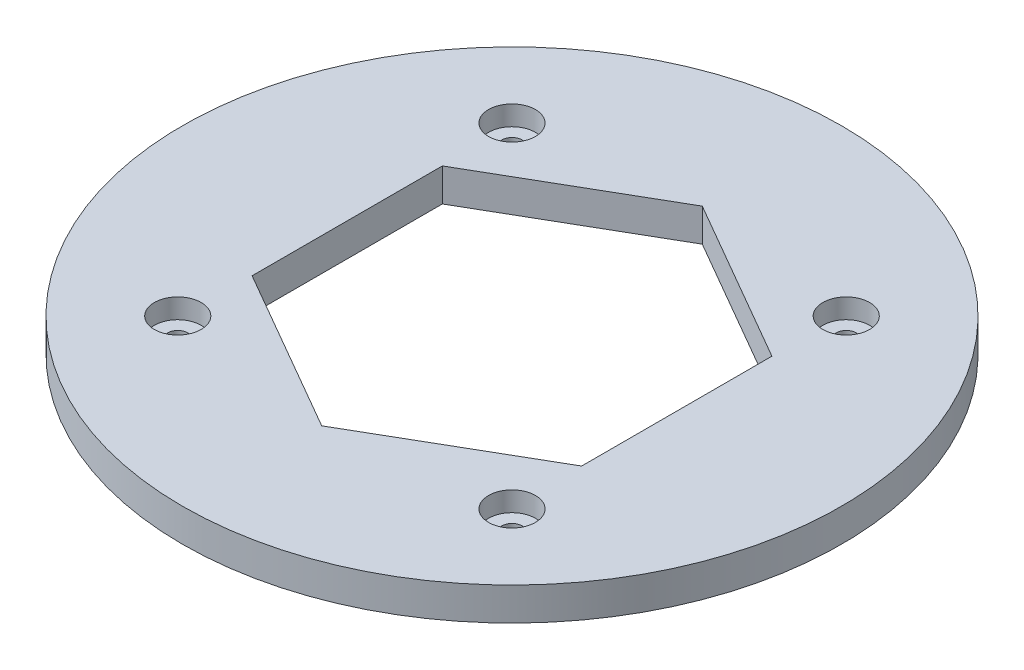
ISO-10303-21;
HEADER;
FILE_DESCRIPTION(('STEP AP214'),'2;1');
FILE_NAME('part.step','',(''),(''),'','','');
FILE_SCHEMA(('AUTOMOTIVE_DESIGN { 1 0 10303 214 1 1 1 1 }'));
ENDSEC;
DATA;
#1=APPLICATION_CONTEXT('core data for automotive mechanical design processes');
#2=APPLICATION_PROTOCOL_DEFINITION('international standard','automotive_design',2000,#1);
#3=PRODUCT_CONTEXT('',#1,'mechanical');
#4=PRODUCT('Part','Part','',(#3));
#5=PRODUCT_RELATED_PRODUCT_CATEGORY('part','',(#4));
#6=PRODUCT_DEFINITION_FORMATION('','',#4);
#7=PRODUCT_DEFINITION_CONTEXT('part definition',#1,'design');
#8=PRODUCT_DEFINITION('design','',#6,#7);
#9=PRODUCT_DEFINITION_SHAPE('','',#8);
#10=(LENGTH_UNIT() NAMED_UNIT(*) SI_UNIT(.MILLI.,.METRE.));
#11=(NAMED_UNIT(*) PLANE_ANGLE_UNIT() SI_UNIT($,.RADIAN.));
#12=(NAMED_UNIT(*) SI_UNIT($,.STERADIAN.) SOLID_ANGLE_UNIT());
#13=UNCERTAINTY_MEASURE_WITH_UNIT(LENGTH_MEASURE(1.E-05),#10,'distance_accuracy_value','');
#14=(GEOMETRIC_REPRESENTATION_CONTEXT(3) GLOBAL_UNCERTAINTY_ASSIGNED_CONTEXT((#13)) GLOBAL_UNIT_ASSIGNED_CONTEXT((#10,
#11,#12)) REPRESENTATION_CONTEXT('',''));
#15=CARTESIAN_POINT('',(0.,0.,0.));
#16=DIRECTION('',(0.,0.,1.));
#17=DIRECTION('',(1.,0.,0.));
#18=AXIS2_PLACEMENT_3D('',#15,#16,#17);
#19=CARTESIAN_POINT('',(-25.3553390593274,5.,-25.3553390593274));
#20=DIRECTION('',(0.,-1.,0.));
#21=DIRECTION('',(0.,0.,-1.));
#22=AXIS2_PLACEMENT_3D('',#19,#20,#21);
#23=CYLINDRICAL_SURFACE('',#22,3.55);
#24=CARTESIAN_POINT('',(-25.3553390593274,2.,-25.3553390593274));
#25=DIRECTION('',(0.,1.,0.));
#26=DIRECTION('',(0.,0.,1.));
#27=AXIS2_PLACEMENT_3D('',#24,#25,#26);
#28=CIRCLE('',#27,3.55);
#29=CARTESIAN_POINT('',(-25.3553390593274,2.,-21.8053390593274));
#30=VERTEX_POINT('',#29);
#31=EDGE_CURVE('E224',#30,#30,#28,.T.);
#32=ORIENTED_EDGE('',*,*,#31,.F.);
#33=EDGE_LOOP('',(#32));
#34=FACE_BOUND('',#33,.T.);
#35=CARTESIAN_POINT('',(-25.3553390593274,5.,-25.3553390593274));
#36=DIRECTION('',(0.,1.,0.));
#37=DIRECTION('',(0.,0.,1.));
#38=AXIS2_PLACEMENT_3D('',#35,#36,#37);
#39=CIRCLE('',#38,3.55);
#40=CARTESIAN_POINT('',(-25.3553390593274,5.,-21.8053390593274));
#41=VERTEX_POINT('',#40);
#42=EDGE_CURVE('E209',#41,#41,#39,.T.);
#43=ORIENTED_EDGE('',*,*,#42,.T.);
#44=EDGE_LOOP('',(#43));
#45=FACE_BOUND('',#44,.T.);
#46=ADVANCED_FACE('F44',(#34,#45),#23,.F.);
#47=CARTESIAN_POINT('',(0.,5.,0.));
#48=DIRECTION('',(0.,-1.,0.));
#49=DIRECTION('',(0.,0.,-1.));
#50=AXIS2_PLACEMENT_3D('',#47,#48,#49);
#51=CYLINDRICAL_SURFACE('',#50,50.);
#52=CARTESIAN_POINT('',(0.,5.,0.));
#53=DIRECTION('',(0.,1.,0.));
#54=DIRECTION('',(0.,0.,1.));
#55=AXIS2_PLACEMENT_3D('',#52,#53,#54);
#56=CIRCLE('',#55,50.);
#57=CARTESIAN_POINT('',(0.,5.,50.));
#58=VERTEX_POINT('',#57);
#59=EDGE_CURVE('E205',#58,#58,#56,.T.);
#60=ORIENTED_EDGE('',*,*,#59,.F.);
#61=EDGE_LOOP('',(#60));
#62=FACE_BOUND('',#61,.T.);
#63=CARTESIAN_POINT('',(0.,0.,0.));
#64=DIRECTION('',(0.,1.,0.));
#65=DIRECTION('',(0.,0.,1.));
#66=AXIS2_PLACEMENT_3D('',#63,#64,#65);
#67=CIRCLE('',#66,50.);
#68=CARTESIAN_POINT('',(0.,0.,50.));
#69=VERTEX_POINT('',#68);
#70=EDGE_CURVE('E193',#69,#69,#67,.T.);
#71=ORIENTED_EDGE('',*,*,#70,.T.);
#72=EDGE_LOOP('',(#71));
#73=FACE_BOUND('',#72,.T.);
#74=ADVANCED_FACE('F270',(#62,#73),#51,.T.);
#75=CARTESIAN_POINT('',(25.3553390593274,5.,-25.3553390593274));
#76=DIRECTION('',(0.,-1.,0.));
#77=DIRECTION('',(0.,0.,-1.));
#78=AXIS2_PLACEMENT_3D('',#75,#76,#77);
#79=CYLINDRICAL_SURFACE('',#78,3.55);
#80=CARTESIAN_POINT('',(25.3553390593274,2.,-25.3553390593274));
#81=DIRECTION('',(0.,1.,0.));
#82=DIRECTION('',(0.,0.,1.));
#83=AXIS2_PLACEMENT_3D('',#80,#81,#82);
#84=CIRCLE('',#83,3.55);
#85=CARTESIAN_POINT('',(25.3553390593274,2.,-21.8053390593274));
#86=VERTEX_POINT('',#85);
#87=EDGE_CURVE('E177',#86,#86,#84,.F.);
#88=ORIENTED_EDGE('',*,*,#87,.T.);
#89=EDGE_LOOP('',(#88));
#90=FACE_BOUND('',#89,.T.);
#91=CARTESIAN_POINT('',(25.3553390593274,5.,-25.3553390593274));
#92=DIRECTION('',(0.,1.,0.));
#93=DIRECTION('',(0.,0.,1.));
#94=AXIS2_PLACEMENT_3D('',#91,#92,#93);
#95=CIRCLE('',#94,3.55);
#96=CARTESIAN_POINT('',(25.3553390593274,5.,-21.8053390593274));
#97=VERTEX_POINT('',#96);
#98=EDGE_CURVE('E201',#97,#97,#95,.F.);
#99=ORIENTED_EDGE('',*,*,#98,.F.);
#100=EDGE_LOOP('',(#99));
#101=FACE_BOUND('',#100,.T.);
#102=ADVANCED_FACE('F276',(#90,#101),#79,.F.);
#103=CARTESIAN_POINT('',(25.3553390593274,5.,25.3553390593274));
#104=DIRECTION('',(0.,-1.,0.));
#105=DIRECTION('',(0.,0.,-1.));
#106=AXIS2_PLACEMENT_3D('',#103,#104,#105);
#107=CYLINDRICAL_SURFACE('',#106,3.55000000000001);
#108=CARTESIAN_POINT('',(25.3553390593274,2.,25.3553390593274));
#109=DIRECTION('',(0.,1.,0.));
#110=DIRECTION('',(0.,0.,1.));
#111=AXIS2_PLACEMENT_3D('',#108,#109,#110);
#112=CIRCLE('',#111,3.55000000000001);
#113=CARTESIAN_POINT('',(25.3553390593274,2.,28.9053390593274));
#114=VERTEX_POINT('',#113);
#115=EDGE_CURVE('E217',#114,#114,#112,.T.);
#116=ORIENTED_EDGE('',*,*,#115,.F.);
#117=EDGE_LOOP('',(#116));
#118=FACE_BOUND('',#117,.T.);
#119=CARTESIAN_POINT('',(25.3553390593274,5.,25.3553390593274));
#120=DIRECTION('',(0.,1.,0.));
#121=DIRECTION('',(0.,0.,1.));
#122=AXIS2_PLACEMENT_3D('',#119,#120,#121);
#123=CIRCLE('',#122,3.55000000000001);
#124=CARTESIAN_POINT('',(25.3553390593274,5.,28.9053390593274));
#125=VERTEX_POINT('',#124);
#126=EDGE_CURVE('E197',#125,#125,#123,.T.);
#127=ORIENTED_EDGE('',*,*,#126,.T.);
#128=EDGE_LOOP('',(#127));
#129=FACE_BOUND('',#128,.T.);
#130=ADVANCED_FACE('F46',(#118,#129),#107,.F.);
#131=CARTESIAN_POINT('',(-25.3553390593274,5.,25.3553390593274));
#132=DIRECTION('',(0.,-1.,0.));
#133=DIRECTION('',(0.,0.,-1.));
#134=AXIS2_PLACEMENT_3D('',#131,#132,#133);
#135=CYLINDRICAL_SURFACE('',#134,3.55);
#136=CARTESIAN_POINT('',(-25.3553390593274,2.,25.3553390593274));
#137=DIRECTION('',(0.,1.,0.));
#138=DIRECTION('',(0.,0.,1.));
#139=AXIS2_PLACEMENT_3D('',#136,#137,#138);
#140=CIRCLE('',#139,3.55);
#141=CARTESIAN_POINT('',(-25.3553390593274,2.,28.9053390593274));
#142=VERTEX_POINT('',#141);
#143=EDGE_CURVE('E157',#142,#142,#140,.F.);
#144=ORIENTED_EDGE('',*,*,#143,.T.);
#145=EDGE_LOOP('',(#144));
#146=FACE_BOUND('',#145,.T.);
#147=CARTESIAN_POINT('',(-25.3553390593274,5.,25.3553390593274));
#148=DIRECTION('',(0.,1.,0.));
#149=DIRECTION('',(0.,0.,1.));
#150=AXIS2_PLACEMENT_3D('',#147,#148,#149);
#151=CIRCLE('',#150,3.55);
#152=CARTESIAN_POINT('',(-25.3553390593274,5.,28.9053390593274));
#153=VERTEX_POINT('',#152);
#154=EDGE_CURVE('E213',#153,#153,#151,.F.);
#155=ORIENTED_EDGE('',*,*,#154,.F.);
#156=EDGE_LOOP('',(#155));
#157=FACE_BOUND('',#156,.T.);
#158=ADVANCED_FACE('F282',(#146,#157),#135,.F.);
#159=CARTESIAN_POINT('',(0.,5.,0.));
#160=DIRECTION('',(0.,1.,0.));
#161=DIRECTION('',(0.,0.,1.));
#162=AXIS2_PLACEMENT_3D('',#159,#160,#161);
#163=PLANE('',#162);
#164=DIRECTION('',(-0.866025403784439,0.,-0.5));
#165=VECTOR('',#164,1.);
#166=CARTESIAN_POINT('',(25.,5.,-14.4337567297407));
#167=LINE('',#166,#165);
#168=CARTESIAN_POINT('',(25.,5.,-14.4337567297407));
#169=VERTEX_POINT('',#168);
#170=CARTESIAN_POINT('',(0.,5.,-28.8675134594813));
#171=VERTEX_POINT('',#170);
#172=EDGE_CURVE('E60',#169,#171,#167,.T.);
#173=ORIENTED_EDGE('',*,*,#172,.F.);
#174=DIRECTION('',(0.,0.,-1.));
#175=VECTOR('',#174,1.);
#176=CARTESIAN_POINT('',(25.,5.,14.4337567297406));
#177=LINE('',#176,#175);
#178=CARTESIAN_POINT('',(25.,5.,14.4337567297406));
#179=VERTEX_POINT('',#178);
#180=EDGE_CURVE('E131',#179,#169,#177,.T.);
#181=ORIENTED_EDGE('',*,*,#180,.F.);
#182=DIRECTION('',(0.866025403784438,0.,-0.5));
#183=VECTOR('',#182,1.);
#184=CARTESIAN_POINT('',(0.,5.,28.8675134594813));
#185=LINE('',#184,#183);
#186=CARTESIAN_POINT('',(0.,5.,28.8675134594813));
#187=VERTEX_POINT('',#186);
#188=EDGE_CURVE('E124',#187,#179,#185,.T.);
#189=ORIENTED_EDGE('',*,*,#188,.F.);
#190=DIRECTION('',(0.866025403784439,0.,0.5));
#191=VECTOR('',#190,1.);
#192=CARTESIAN_POINT('',(-25.,5.,14.4337567297407));
#193=LINE('',#192,#191);
#194=CARTESIAN_POINT('',(-25.,5.,14.4337567297407));
#195=VERTEX_POINT('',#194);
#196=EDGE_CURVE('E120',#195,#187,#193,.T.);
#197=ORIENTED_EDGE('',*,*,#196,.F.);
#198=DIRECTION('',(0.,0.,1.));
#199=VECTOR('',#198,1.);
#200=CARTESIAN_POINT('',(-25.,5.,-14.4337567297406));
#201=LINE('',#200,#199);
#202=CARTESIAN_POINT('',(-25.,5.,-14.4337567297406));
#203=VERTEX_POINT('',#202);
#204=EDGE_CURVE('E101',#203,#195,#201,.T.);
#205=ORIENTED_EDGE('',*,*,#204,.F.);
#206=DIRECTION('',(-0.866025403784438,0.,0.5));
#207=VECTOR('',#206,1.);
#208=CARTESIAN_POINT('',(0.,5.,-28.8675134594813));
#209=LINE('',#208,#207);
#210=EDGE_CURVE('E111',#171,#203,#209,.T.);
#211=ORIENTED_EDGE('',*,*,#210,.F.);
#212=EDGE_LOOP('',(#173,#181,#189,#197,#205,#211));
#213=FACE_BOUND('',#212,.T.);
#214=ORIENTED_EDGE('',*,*,#126,.F.);
#215=EDGE_LOOP('',(#214));
#216=FACE_BOUND('',#215,.T.);
#217=ORIENTED_EDGE('',*,*,#98,.T.);
#218=EDGE_LOOP('',(#217));
#219=FACE_BOUND('',#218,.T.);
#220=ORIENTED_EDGE('',*,*,#59,.T.);
#221=EDGE_LOOP('',(#220));
#222=FACE_BOUND('',#221,.T.);
#223=ORIENTED_EDGE('',*,*,#42,.F.);
#224=EDGE_LOOP('',(#223));
#225=FACE_BOUND('',#224,.T.);
#226=ORIENTED_EDGE('',*,*,#154,.T.);
#227=EDGE_LOOP('',(#226));
#228=FACE_BOUND('',#227,.T.);
#229=ADVANCED_FACE('F116',(#213,#216,#219,#222,#225,#228),#163,.T.);
#230=CARTESIAN_POINT('',(0.,0.,0.));
#231=DIRECTION('',(0.,1.,0.));
#232=DIRECTION('',(0.,0.,1.));
#233=AXIS2_PLACEMENT_3D('',#230,#231,#232);
#234=PLANE('',#233);
#235=DIRECTION('',(0.,0.,-1.));
#236=VECTOR('',#235,1.);
#237=CARTESIAN_POINT('',(25.,0.,0.));
#238=LINE('',#237,#236);
#239=CARTESIAN_POINT('',(25.,0.,14.4337567297406));
#240=VERTEX_POINT('',#239);
#241=CARTESIAN_POINT('',(25.,0.,-14.4337567297407));
#242=VERTEX_POINT('',#241);
#243=EDGE_CURVE('E53',#240,#242,#238,.T.);
#244=ORIENTED_EDGE('',*,*,#243,.T.);
#245=DIRECTION('',(-0.866025403784439,0.,-0.5));
#246=VECTOR('',#245,1.);
#247=CARTESIAN_POINT('',(12.5,0.,-21.650635094611));
#248=LINE('',#247,#246);
#249=CARTESIAN_POINT('',(0.,0.,-28.8675134594813));
#250=VERTEX_POINT('',#249);
#251=EDGE_CURVE('E11',#242,#250,#248,.T.);
#252=ORIENTED_EDGE('',*,*,#251,.T.);
#253=DIRECTION('',(-0.866025403784439,0.,0.5));
#254=VECTOR('',#253,1.);
#255=CARTESIAN_POINT('',(-12.5,0.,-21.650635094611));
#256=LINE('',#255,#254);
#257=CARTESIAN_POINT('',(-25.,0.,-14.4337567297406));
#258=VERTEX_POINT('',#257);
#259=EDGE_CURVE('E228',#250,#258,#256,.T.);
#260=ORIENTED_EDGE('',*,*,#259,.T.);
#261=DIRECTION('',(0.,0.,1.));
#262=VECTOR('',#261,1.);
#263=CARTESIAN_POINT('',(-25.,0.,0.));
#264=LINE('',#263,#262);
#265=CARTESIAN_POINT('',(-25.,0.,14.4337567297407));
#266=VERTEX_POINT('',#265);
#267=EDGE_CURVE('E104',#258,#266,#264,.T.);
#268=ORIENTED_EDGE('',*,*,#267,.T.);
#269=DIRECTION('',(0.866025403784439,0.,0.5));
#270=VECTOR('',#269,1.);
#271=CARTESIAN_POINT('',(-12.5,0.,21.650635094611));
#272=LINE('',#271,#270);
#273=CARTESIAN_POINT('',(0.,0.,28.8675134594813));
#274=VERTEX_POINT('',#273);
#275=EDGE_CURVE('E233',#266,#274,#272,.T.);
#276=ORIENTED_EDGE('',*,*,#275,.T.);
#277=DIRECTION('',(0.866025403784439,0.,-0.5));
#278=VECTOR('',#277,1.);
#279=CARTESIAN_POINT('',(12.5,0.,21.650635094611));
#280=LINE('',#279,#278);
#281=EDGE_CURVE('E237',#274,#240,#280,.T.);
#282=ORIENTED_EDGE('',*,*,#281,.T.);
#283=EDGE_LOOP('',(#244,#252,#260,#268,#276,#282));
#284=FACE_BOUND('',#283,.T.);
#285=CARTESIAN_POINT('',(0.,0.,35.3553390593274));
#286=DIRECTION('',(0.,-1.,0.));
#287=DIRECTION('',(0.,0.,-1.));
#288=AXIS2_PLACEMENT_3D('',#285,#286,#287);
#289=CIRCLE('',#288,5.5);
#290=CARTESIAN_POINT('',(0.,0.,29.8553390593274));
#291=VERTEX_POINT('',#290);
#292=EDGE_CURVE('E138',#291,#291,#289,.T.);
#293=ORIENTED_EDGE('',*,*,#292,.F.);
#294=EDGE_LOOP('',(#293));
#295=FACE_BOUND('',#294,.T.);
#296=ORIENTED_EDGE('',*,*,#70,.F.);
#297=EDGE_LOOP('',(#296));
#298=FACE_BOUND('',#297,.T.);
#299=CARTESIAN_POINT('',(25.3553390593274,0.,25.3553390593274));
#300=DIRECTION('',(0.,1.,0.));
#301=DIRECTION('',(0.,0.,1.));
#302=AXIS2_PLACEMENT_3D('',#299,#300,#301);
#303=CIRCLE('',#302,1.55000000000001);
#304=CARTESIAN_POINT('',(25.3553390593274,0.,26.9053390593274));
#305=VERTEX_POINT('',#304);
#306=EDGE_CURVE('E185',#305,#305,#303,.T.);
#307=ORIENTED_EDGE('',*,*,#306,.T.);
#308=EDGE_LOOP('',(#307));
#309=FACE_BOUND('',#308,.T.);
#310=CARTESIAN_POINT('',(25.3553390593274,0.,-25.3553390593274));
#311=DIRECTION('',(0.,1.,0.));
#312=DIRECTION('',(0.,0.,1.));
#313=AXIS2_PLACEMENT_3D('',#310,#311,#312);
#314=CIRCLE('',#313,1.55);
#315=CARTESIAN_POINT('',(25.3553390593274,0.,-23.8053390593274));
#316=VERTEX_POINT('',#315);
#317=EDGE_CURVE('E173',#316,#316,#314,.F.);
#318=ORIENTED_EDGE('',*,*,#317,.F.);
#319=EDGE_LOOP('',(#318));
#320=FACE_BOUND('',#319,.T.);
#321=CARTESIAN_POINT('',(-25.3553390593274,0.,-25.3553390593274));
#322=DIRECTION('',(0.,1.,0.));
#323=DIRECTION('',(0.,0.,1.));
#324=AXIS2_PLACEMENT_3D('',#321,#322,#323);
#325=CIRCLE('',#324,1.55);
#326=CARTESIAN_POINT('',(-25.3553390593274,0.,-23.8053390593274));
#327=VERTEX_POINT('',#326);
#328=EDGE_CURVE('E165',#327,#327,#325,.T.);
#329=ORIENTED_EDGE('',*,*,#328,.T.);
#330=EDGE_LOOP('',(#329));
#331=FACE_BOUND('',#330,.T.);
#332=CARTESIAN_POINT('',(-25.3553390593274,0.,25.3553390593274));
#333=DIRECTION('',(0.,1.,0.));
#334=DIRECTION('',(0.,0.,1.));
#335=AXIS2_PLACEMENT_3D('',#332,#333,#334);
#336=CIRCLE('',#335,1.55);
#337=CARTESIAN_POINT('',(-25.3553390593274,0.,26.9053390593274));
#338=VERTEX_POINT('',#337);
#339=EDGE_CURVE('E153',#338,#338,#336,.F.);
#340=ORIENTED_EDGE('',*,*,#339,.F.);
#341=EDGE_LOOP('',(#340));
#342=FACE_BOUND('',#341,.T.);
#343=ADVANCED_FACE('F243',(#284,#295,#298,#309,#320,#331,#342),#234,.F.);
#344=CARTESIAN_POINT('',(25.3553390593274,2.,25.3553390593274));
#345=DIRECTION('',(0.,-1.,0.));
#346=DIRECTION('',(0.,0.,-1.));
#347=AXIS2_PLACEMENT_3D('',#344,#345,#346);
#348=CYLINDRICAL_SURFACE('',#347,1.55000000000001);
#349=CARTESIAN_POINT('',(25.3553390593274,2.,25.3553390593274));
#350=DIRECTION('',(0.,1.,0.));
#351=DIRECTION('',(0.,0.,1.));
#352=AXIS2_PLACEMENT_3D('',#349,#350,#351);
#353=CIRCLE('',#352,1.55000000000001);
#354=CARTESIAN_POINT('',(25.3553390593274,2.,26.9053390593274));
#355=VERTEX_POINT('',#354);
#356=EDGE_CURVE('E189',#355,#355,#353,.T.);
#357=ORIENTED_EDGE('',*,*,#356,.T.);
#358=EDGE_LOOP('',(#357));
#359=FACE_BOUND('',#358,.T.);
#360=ORIENTED_EDGE('',*,*,#306,.F.);
#361=EDGE_LOOP('',(#360));
#362=FACE_BOUND('',#361,.T.);
#363=ADVANCED_FACE('F324',(#359,#362),#348,.F.);
#364=CARTESIAN_POINT('',(0.,2.,0.));
#365=DIRECTION('',(0.,1.,0.));
#366=DIRECTION('',(0.,0.,1.));
#367=AXIS2_PLACEMENT_3D('',#364,#365,#366);
#368=PLANE('',#367);
#369=ORIENTED_EDGE('',*,*,#356,.F.);
#370=EDGE_LOOP('',(#369));
#371=FACE_BOUND('',#370,.T.);
#372=ORIENTED_EDGE('',*,*,#115,.T.);
#373=EDGE_LOOP('',(#372));
#374=FACE_BOUND('',#373,.T.);
#375=ADVANCED_FACE('F328',(#371,#374),#368,.T.);
#376=CARTESIAN_POINT('',(25.3553390593274,2.,-25.3553390593274));
#377=DIRECTION('',(0.,-1.,0.));
#378=DIRECTION('',(0.,0.,-1.));
#379=AXIS2_PLACEMENT_3D('',#376,#377,#378);
#380=CYLINDRICAL_SURFACE('',#379,1.55);
#381=CARTESIAN_POINT('',(25.3553390593274,2.,-25.3553390593274));
#382=DIRECTION('',(0.,1.,0.));
#383=DIRECTION('',(0.,0.,1.));
#384=AXIS2_PLACEMENT_3D('',#381,#382,#383);
#385=CIRCLE('',#384,1.55);
#386=CARTESIAN_POINT('',(25.3553390593274,2.,-23.8053390593274));
#387=VERTEX_POINT('',#386);
#388=EDGE_CURVE('E181',#387,#387,#385,.F.);
#389=ORIENTED_EDGE('',*,*,#388,.F.);
#390=EDGE_LOOP('',(#389));
#391=FACE_BOUND('',#390,.T.);
#392=ORIENTED_EDGE('',*,*,#317,.T.);
#393=EDGE_LOOP('',(#392));
#394=FACE_BOUND('',#393,.T.);
#395=ADVANCED_FACE('F334',(#391,#394),#380,.F.);
#396=CARTESIAN_POINT('',(0.,2.,0.));
#397=DIRECTION('',(0.,1.,0.));
#398=DIRECTION('',(0.,0.,1.));
#399=AXIS2_PLACEMENT_3D('',#396,#397,#398);
#400=PLANE('',#399);
#401=ORIENTED_EDGE('',*,*,#87,.F.);
#402=EDGE_LOOP('',(#401));
#403=FACE_BOUND('',#402,.T.);
#404=ORIENTED_EDGE('',*,*,#388,.T.);
#405=EDGE_LOOP('',(#404));
#406=FACE_BOUND('',#405,.T.);
#407=ADVANCED_FACE('F338',(#403,#406),#400,.T.);
#408=CARTESIAN_POINT('',(-25.3553390593274,2.,-25.3553390593274));
#409=DIRECTION('',(0.,-1.,0.));
#410=DIRECTION('',(0.,0.,-1.));
#411=AXIS2_PLACEMENT_3D('',#408,#409,#410);
#412=CYLINDRICAL_SURFACE('',#411,1.55);
#413=CARTESIAN_POINT('',(-25.3553390593274,2.,-25.3553390593274));
#414=DIRECTION('',(0.,1.,0.));
#415=DIRECTION('',(0.,0.,1.));
#416=AXIS2_PLACEMENT_3D('',#413,#414,#415);
#417=CIRCLE('',#416,1.55);
#418=CARTESIAN_POINT('',(-25.3553390593274,2.,-23.8053390593274));
#419=VERTEX_POINT('',#418);
#420=EDGE_CURVE('E169',#419,#419,#417,.T.);
#421=ORIENTED_EDGE('',*,*,#420,.T.);
#422=EDGE_LOOP('',(#421));
#423=FACE_BOUND('',#422,.T.);
#424=ORIENTED_EDGE('',*,*,#328,.F.);
#425=EDGE_LOOP('',(#424));
#426=FACE_BOUND('',#425,.T.);
#427=ADVANCED_FACE('F342',(#423,#426),#412,.F.);
#428=CARTESIAN_POINT('',(0.,2.,0.));
#429=DIRECTION('',(0.,1.,0.));
#430=DIRECTION('',(0.,0.,1.));
#431=AXIS2_PLACEMENT_3D('',#428,#429,#430);
#432=PLANE('',#431);
#433=ORIENTED_EDGE('',*,*,#420,.F.);
#434=EDGE_LOOP('',(#433));
#435=FACE_BOUND('',#434,.T.);
#436=ORIENTED_EDGE('',*,*,#31,.T.);
#437=EDGE_LOOP('',(#436));
#438=FACE_BOUND('',#437,.T.);
#439=ADVANCED_FACE('F319',(#435,#438),#432,.T.);
#440=CARTESIAN_POINT('',(-25.3553390593274,2.,25.3553390593274));
#441=DIRECTION('',(0.,-1.,0.));
#442=DIRECTION('',(0.,0.,-1.));
#443=AXIS2_PLACEMENT_3D('',#440,#441,#442);
#444=CYLINDRICAL_SURFACE('',#443,1.55);
#445=CARTESIAN_POINT('',(-25.3553390593274,2.,25.3553390593274));
#446=DIRECTION('',(0.,1.,0.));
#447=DIRECTION('',(0.,0.,1.));
#448=AXIS2_PLACEMENT_3D('',#445,#446,#447);
#449=CIRCLE('',#448,1.55);
#450=CARTESIAN_POINT('',(-25.3553390593274,2.,26.9053390593274));
#451=VERTEX_POINT('',#450);
#452=EDGE_CURVE('E161',#451,#451,#449,.F.);
#453=ORIENTED_EDGE('',*,*,#452,.F.);
#454=EDGE_LOOP('',(#453));
#455=FACE_BOUND('',#454,.T.);
#456=ORIENTED_EDGE('',*,*,#339,.T.);
#457=EDGE_LOOP('',(#456));
#458=FACE_BOUND('',#457,.T.);
#459=ADVANCED_FACE('F313',(#455,#458),#444,.F.);
#460=CARTESIAN_POINT('',(0.,2.,0.));
#461=DIRECTION('',(0.,1.,0.));
#462=DIRECTION('',(0.,0.,1.));
#463=AXIS2_PLACEMENT_3D('',#460,#461,#462);
#464=PLANE('',#463);
#465=ORIENTED_EDGE('',*,*,#143,.F.);
#466=EDGE_LOOP('',(#465));
#467=FACE_BOUND('',#466,.T.);
#468=ORIENTED_EDGE('',*,*,#452,.T.);
#469=EDGE_LOOP('',(#468));
#470=FACE_BOUND('',#469,.T.);
#471=ADVANCED_FACE('F310',(#467,#470),#464,.T.);
#472=CARTESIAN_POINT('',(0.,2.5,35.3553390593274));
#473=DIRECTION('',(0.,-1.,0.));
#474=DIRECTION('',(0.,0.,-1.));
#475=AXIS2_PLACEMENT_3D('',#472,#473,#474);
#476=CYLINDRICAL_SURFACE('',#475,5.5);
#477=CARTESIAN_POINT('',(0.,2.5,35.3553390593274));
#478=DIRECTION('',(0.,-1.,0.));
#479=DIRECTION('',(0.,0.,-1.));
#480=AXIS2_PLACEMENT_3D('',#477,#478,#479);
#481=CIRCLE('',#480,5.5);
#482=CARTESIAN_POINT('',(0.,2.5,29.8553390593274));
#483=VERTEX_POINT('',#482);
#484=EDGE_CURVE('E149',#483,#483,#481,.T.);
#485=ORIENTED_EDGE('',*,*,#484,.F.);
#486=EDGE_LOOP('',(#485));
#487=FACE_BOUND('',#486,.T.);
#488=ORIENTED_EDGE('',*,*,#292,.T.);
#489=EDGE_LOOP('',(#488));
#490=FACE_BOUND('',#489,.T.);
#491=ADVANCED_FACE('F265',(#487,#490),#476,.F.);
#492=CARTESIAN_POINT('',(0.,2.5,35.3553390593274));
#493=DIRECTION('',(0.,-1.,0.));
#494=DIRECTION('',(0.,0.,-1.));
#495=AXIS2_PLACEMENT_3D('',#492,#493,#494);
#496=PLANE('',#495);
#497=ORIENTED_EDGE('',*,*,#484,.T.);
#498=EDGE_LOOP('',(#497));
#499=FACE_BOUND('',#498,.T.);
#500=ADVANCED_FACE('F258',(#499),#496,.T.);
#501=CARTESIAN_POINT('',(25.,-5.,-14.4337567297407));
#502=DIRECTION('',(0.5,0.,-0.866025403784439));
#503=DIRECTION('',(-0.866025403784439,0.,-0.5));
#504=AXIS2_PLACEMENT_3D('',#501,#502,#503);
#505=PLANE('',#504);
#506=DIRECTION('',(0.,1.,0.));
#507=VECTOR('',#506,1.);
#508=CARTESIAN_POINT('',(25.,-5.,-14.4337567297407));
#509=LINE('',#508,#507);
#510=EDGE_CURVE('E135',#242,#169,#509,.T.);
#511=ORIENTED_EDGE('',*,*,#510,.T.);
#512=ORIENTED_EDGE('',*,*,#172,.T.);
#513=DIRECTION('',(0.,1.,0.));
#514=VECTOR('',#513,1.);
#515=CARTESIAN_POINT('',(0.,-5.,-28.8675134594813));
#516=LINE('',#515,#514);
#517=EDGE_CURVE('E108',#250,#171,#516,.T.);
#518=ORIENTED_EDGE('',*,*,#517,.F.);
#519=ORIENTED_EDGE('',*,*,#251,.F.);
#520=EDGE_LOOP('',(#511,#512,#518,#519));
#521=FACE_BOUND('',#520,.T.);
#522=ADVANCED_FACE('F256',(#521),#505,.F.);
#523=CARTESIAN_POINT('',(25.,-5.,14.4337567297406));
#524=DIRECTION('',(1.,0.,0.));
#525=DIRECTION('',(0.,0.,-1.));
#526=AXIS2_PLACEMENT_3D('',#523,#524,#525);
#527=PLANE('',#526);
#528=DIRECTION('',(0.,1.,0.));
#529=VECTOR('',#528,1.);
#530=CARTESIAN_POINT('',(25.,-5.,14.4337567297406));
#531=LINE('',#530,#529);
#532=EDGE_CURVE('E139',#240,#179,#531,.T.);
#533=ORIENTED_EDGE('',*,*,#532,.T.);
#534=ORIENTED_EDGE('',*,*,#180,.T.);
#535=ORIENTED_EDGE('',*,*,#510,.F.);
#536=ORIENTED_EDGE('',*,*,#243,.F.);
#537=EDGE_LOOP('',(#533,#534,#535,#536));
#538=FACE_BOUND('',#537,.T.);
#539=ADVANCED_FACE('F248',(#538),#527,.F.);
#540=CARTESIAN_POINT('',(0.,-5.,28.8675134594813));
#541=DIRECTION('',(0.5,0.,0.866025403784439));
#542=DIRECTION('',(0.866025403784439,0.,-0.5));
#543=AXIS2_PLACEMENT_3D('',#540,#541,#542);
#544=PLANE('',#543);
#545=DIRECTION('',(0.,1.,0.));
#546=VECTOR('',#545,1.);
#547=CARTESIAN_POINT('',(0.,-5.,28.8675134594813));
#548=LINE('',#547,#546);
#549=EDGE_CURVE('E142',#274,#187,#548,.T.);
#550=ORIENTED_EDGE('',*,*,#549,.T.);
#551=ORIENTED_EDGE('',*,*,#188,.T.);
#552=ORIENTED_EDGE('',*,*,#532,.F.);
#553=ORIENTED_EDGE('',*,*,#281,.F.);
#554=EDGE_LOOP('',(#550,#551,#552,#553));
#555=FACE_BOUND('',#554,.T.);
#556=ADVANCED_FACE('F250',(#555),#544,.F.);
#557=CARTESIAN_POINT('',(-25.,-5.,14.4337567297407));
#558=DIRECTION('',(-0.5,0.,0.866025403784439));
#559=DIRECTION('',(0.866025403784439,0.,0.5));
#560=AXIS2_PLACEMENT_3D('',#557,#558,#559);
#561=PLANE('',#560);
#562=DIRECTION('',(0.,1.,0.));
#563=VECTOR('',#562,1.);
#564=CARTESIAN_POINT('',(-25.,-5.,14.4337567297407));
#565=LINE('',#564,#563);
#566=EDGE_CURVE('E107',#266,#195,#565,.T.);
#567=ORIENTED_EDGE('',*,*,#566,.T.);
#568=ORIENTED_EDGE('',*,*,#196,.T.);
#569=ORIENTED_EDGE('',*,*,#549,.F.);
#570=ORIENTED_EDGE('',*,*,#275,.F.);
#571=EDGE_LOOP('',(#567,#568,#569,#570));
#572=FACE_BOUND('',#571,.T.);
#573=ADVANCED_FACE('F255',(#572),#561,.F.);
#574=CARTESIAN_POINT('',(-25.,-5.,-14.4337567297406));
#575=DIRECTION('',(-1.,0.,0.));
#576=DIRECTION('',(0.,0.,1.));
#577=AXIS2_PLACEMENT_3D('',#574,#575,#576);
#578=PLANE('',#577);
#579=DIRECTION('',(0.,1.,0.));
#580=VECTOR('',#579,1.);
#581=CARTESIAN_POINT('',(-25.,-5.,-14.4337567297406));
#582=LINE('',#581,#580);
#583=EDGE_CURVE('E68',#258,#203,#582,.T.);
#584=ORIENTED_EDGE('',*,*,#583,.T.);
#585=ORIENTED_EDGE('',*,*,#204,.T.);
#586=ORIENTED_EDGE('',*,*,#566,.F.);
#587=ORIENTED_EDGE('',*,*,#267,.F.);
#588=EDGE_LOOP('',(#584,#585,#586,#587));
#589=FACE_BOUND('',#588,.T.);
#590=ADVANCED_FACE('F98',(#589),#578,.F.);
#591=CARTESIAN_POINT('',(0.,-5.,-28.8675134594813));
#592=DIRECTION('',(-0.5,0.,-0.866025403784438));
#593=DIRECTION('',(-0.866025403784439,0.,0.5));
#594=AXIS2_PLACEMENT_3D('',#591,#592,#593);
#595=PLANE('',#594);
#596=ORIENTED_EDGE('',*,*,#517,.T.);
#597=ORIENTED_EDGE('',*,*,#210,.T.);
#598=ORIENTED_EDGE('',*,*,#583,.F.);
#599=ORIENTED_EDGE('',*,*,#259,.F.);
#600=EDGE_LOOP('',(#596,#597,#598,#599));
#601=FACE_BOUND('',#600,.T.);
#602=ADVANCED_FACE('F112',(#601),#595,.F.);
#603=CLOSED_SHELL('',(#46,#74,#102,#130,#158,#229,#343,#363,#375,#395,#407,#427,#439,#459,#471,
#491,#500,#522,#539,#556,#573,#590,#602));
#604=MANIFOLD_SOLID_BREP('B2',#603);
#605=ADVANCED_BREP_SHAPE_REPRESENTATION('',(#18,#604),#14);
#606=SHAPE_DEFINITION_REPRESENTATION(#9,#605);
ENDSEC;
END-ISO-10303-21;
